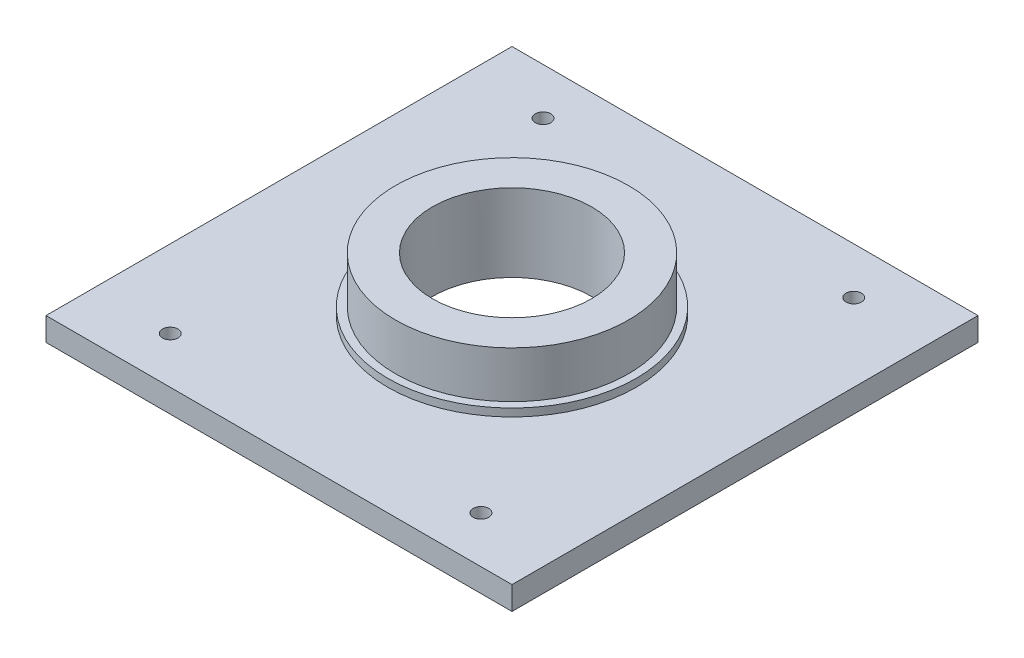
ISO-10303-21;
HEADER;
FILE_DESCRIPTION(('STEP AP214'),'2;1');
FILE_NAME('part.step','',(''),(''),'','','');
FILE_SCHEMA(('AUTOMOTIVE_DESIGN { 1 0 10303 214 1 1 1 1 }'));
ENDSEC;
DATA;
#1=APPLICATION_CONTEXT('core data for automotive mechanical design processes');
#2=APPLICATION_PROTOCOL_DEFINITION('international standard','automotive_design',2000,#1);
#3=PRODUCT_CONTEXT('',#1,'mechanical');
#4=PRODUCT('Part','Part','',(#3));
#5=PRODUCT_RELATED_PRODUCT_CATEGORY('part','',(#4));
#6=PRODUCT_DEFINITION_FORMATION('','',#4);
#7=PRODUCT_DEFINITION_CONTEXT('part definition',#1,'design');
#8=PRODUCT_DEFINITION('design','',#6,#7);
#9=PRODUCT_DEFINITION_SHAPE('','',#8);
#10=(LENGTH_UNIT() NAMED_UNIT(*) SI_UNIT(.MILLI.,.METRE.));
#11=(NAMED_UNIT(*) PLANE_ANGLE_UNIT() SI_UNIT($,.RADIAN.));
#12=(NAMED_UNIT(*) SI_UNIT($,.STERADIAN.) SOLID_ANGLE_UNIT());
#13=UNCERTAINTY_MEASURE_WITH_UNIT(LENGTH_MEASURE(1.E-05),#10,'distance_accuracy_value','');
#14=(GEOMETRIC_REPRESENTATION_CONTEXT(3) GLOBAL_UNCERTAINTY_ASSIGNED_CONTEXT((#13)) GLOBAL_UNIT_ASSIGNED_CONTEXT((#10,
#11,#12)) REPRESENTATION_CONTEXT('',''));
#15=CARTESIAN_POINT('',(0.,0.,0.));
#16=DIRECTION('',(0.,0.,1.));
#17=DIRECTION('',(1.,0.,0.));
#18=AXIS2_PLACEMENT_3D('',#15,#16,#17);
#19=CARTESIAN_POINT('',(0.,4.,0.));
#20=DIRECTION('',(0.,1.,0.));
#21=DIRECTION('',(0.,0.,1.));
#22=AXIS2_PLACEMENT_3D('',#19,#20,#21);
#23=PLANE('',#22);
#24=CARTESIAN_POINT('',(0.,4.,0.));
#25=DIRECTION('',(0.,1.,0.));
#26=DIRECTION('',(0.,0.,1.));
#27=AXIS2_PLACEMENT_3D('',#24,#25,#26);
#28=CIRCLE('',#27,16.);
#29=CARTESIAN_POINT('',(0.,4.,16.));
#30=VERTEX_POINT('',#29);
#31=EDGE_CURVE('E203',#30,#30,#28,.T.);
#32=ORIENTED_EDGE('',*,*,#31,.T.);
#33=EDGE_LOOP('',(#32));
#34=FACE_BOUND('',#33,.T.);
#35=CARTESIAN_POINT('',(0.,4.,0.));
#36=DIRECTION('',(0.,1.,0.));
#37=DIRECTION('',(0.,0.,1.));
#38=AXIS2_PLACEMENT_3D('',#35,#36,#37);
#39=CIRCLE('',#38,15.);
#40=CARTESIAN_POINT('',(0.,4.,15.));
#41=VERTEX_POINT('',#40);
#42=EDGE_CURVE('E43',#41,#41,#39,.F.);
#43=ORIENTED_EDGE('',*,*,#42,.T.);
#44=EDGE_LOOP('',(#43));
#45=FACE_BOUND('',#44,.T.);
#46=ADVANCED_FACE('F39',(#34,#45),#23,.T.);
#47=CARTESIAN_POINT('',(-30.,3.,30.));
#48=DIRECTION('',(1.,0.,0.));
#49=DIRECTION('',(0.,0.,-1.));
#50=AXIS2_PLACEMENT_3D('',#47,#48,#49);
#51=PLANE('',#50);
#52=DIRECTION('',(0.,0.,1.));
#53=VECTOR('',#52,1.);
#54=CARTESIAN_POINT('',(-30.,0.,30.));
#55=LINE('',#54,#53);
#56=CARTESIAN_POINT('',(-30.,0.,-30.));
#57=VERTEX_POINT('',#56);
#58=CARTESIAN_POINT('',(-30.,0.,30.));
#59=VERTEX_POINT('',#58);
#60=EDGE_CURVE('E108',#57,#59,#55,.T.);
#61=ORIENTED_EDGE('',*,*,#60,.T.);
#62=DIRECTION('',(0.,-1.,0.));
#63=VECTOR('',#62,1.);
#64=CARTESIAN_POINT('',(-30.,3.,30.));
#65=LINE('',#64,#63);
#66=CARTESIAN_POINT('',(-30.,3.,30.));
#67=VERTEX_POINT('',#66);
#68=EDGE_CURVE('E47',#67,#59,#65,.T.);
#69=ORIENTED_EDGE('',*,*,#68,.F.);
#70=DIRECTION('',(0.,0.,1.));
#71=VECTOR('',#70,1.);
#72=CARTESIAN_POINT('',(-30.,3.,30.));
#73=LINE('',#72,#71);
#74=CARTESIAN_POINT('',(-30.,3.,-30.));
#75=VERTEX_POINT('',#74);
#76=EDGE_CURVE('E93',#75,#67,#73,.T.);
#77=ORIENTED_EDGE('',*,*,#76,.F.);
#78=DIRECTION('',(0.,-1.,0.));
#79=VECTOR('',#78,1.);
#80=CARTESIAN_POINT('',(-30.,3.,-30.));
#81=LINE('',#80,#79);
#82=EDGE_CURVE('E104',#75,#57,#81,.T.);
#83=ORIENTED_EDGE('',*,*,#82,.T.);
#84=EDGE_LOOP('',(#61,#69,#77,#83));
#85=FACE_BOUND('',#84,.T.);
#86=ADVANCED_FACE('F41',(#85),#51,.F.);
#87=CARTESIAN_POINT('',(30.,3.,30.));
#88=DIRECTION('',(0.,0.,-1.));
#89=DIRECTION('',(-1.,0.,0.));
#90=AXIS2_PLACEMENT_3D('',#87,#88,#89);
#91=PLANE('',#90);
#92=DIRECTION('',(1.,0.,0.));
#93=VECTOR('',#92,1.);
#94=CARTESIAN_POINT('',(30.,0.,30.));
#95=LINE('',#94,#93);
#96=CARTESIAN_POINT('',(30.,0.,30.));
#97=VERTEX_POINT('',#96);
#98=EDGE_CURVE('E100',#59,#97,#95,.T.);
#99=ORIENTED_EDGE('',*,*,#98,.T.);
#100=DIRECTION('',(0.,-1.,0.));
#101=VECTOR('',#100,1.);
#102=CARTESIAN_POINT('',(30.,3.,30.));
#103=LINE('',#102,#101);
#104=CARTESIAN_POINT('',(30.,3.,30.));
#105=VERTEX_POINT('',#104);
#106=EDGE_CURVE('E97',#105,#97,#103,.T.);
#107=ORIENTED_EDGE('',*,*,#106,.F.);
#108=DIRECTION('',(1.,0.,0.));
#109=VECTOR('',#108,1.);
#110=CARTESIAN_POINT('',(30.,3.,30.));
#111=LINE('',#110,#109);
#112=EDGE_CURVE('E87',#67,#105,#111,.T.);
#113=ORIENTED_EDGE('',*,*,#112,.F.);
#114=ORIENTED_EDGE('',*,*,#68,.T.);
#115=EDGE_LOOP('',(#99,#107,#113,#114));
#116=FACE_BOUND('',#115,.T.);
#117=ADVANCED_FACE('F96',(#116),#91,.F.);
#118=CARTESIAN_POINT('',(30.,3.,30.));
#119=DIRECTION('',(-1.,0.,0.));
#120=DIRECTION('',(0.,0.,1.));
#121=AXIS2_PLACEMENT_3D('',#118,#119,#120);
#122=PLANE('',#121);
#123=DIRECTION('',(0.,0.,-1.));
#124=VECTOR('',#123,1.);
#125=CARTESIAN_POINT('',(30.,0.,30.));
#126=LINE('',#125,#124);
#127=CARTESIAN_POINT('',(30.,0.,-30.));
#128=VERTEX_POINT('',#127);
#129=EDGE_CURVE('E74',#97,#128,#126,.T.);
#130=ORIENTED_EDGE('',*,*,#129,.T.);
#131=DIRECTION('',(0.,-1.,0.));
#132=VECTOR('',#131,1.);
#133=CARTESIAN_POINT('',(30.,3.,-30.));
#134=LINE('',#133,#132);
#135=CARTESIAN_POINT('',(30.,3.,-30.));
#136=VERTEX_POINT('',#135);
#137=EDGE_CURVE('E99',#136,#128,#134,.T.);
#138=ORIENTED_EDGE('',*,*,#137,.F.);
#139=DIRECTION('',(0.,0.,-1.));
#140=VECTOR('',#139,1.);
#141=CARTESIAN_POINT('',(30.,3.,30.));
#142=LINE('',#141,#140);
#143=EDGE_CURVE('E95',#105,#136,#142,.T.);
#144=ORIENTED_EDGE('',*,*,#143,.F.);
#145=ORIENTED_EDGE('',*,*,#106,.T.);
#146=EDGE_LOOP('',(#130,#138,#144,#145));
#147=FACE_BOUND('',#146,.T.);
#148=ADVANCED_FACE('F105',(#147),#122,.F.);
#149=CARTESIAN_POINT('',(30.,3.,-30.));
#150=DIRECTION('',(0.,0.,1.));
#151=DIRECTION('',(1.,0.,0.));
#152=AXIS2_PLACEMENT_3D('',#149,#150,#151);
#153=PLANE('',#152);
#154=DIRECTION('',(-1.,0.,0.));
#155=VECTOR('',#154,1.);
#156=CARTESIAN_POINT('',(30.,0.,-30.));
#157=LINE('',#156,#155);
#158=EDGE_CURVE('E82',#128,#57,#157,.T.);
#159=ORIENTED_EDGE('',*,*,#158,.T.);
#160=ORIENTED_EDGE('',*,*,#82,.F.);
#161=DIRECTION('',(-1.,0.,0.));
#162=VECTOR('',#161,1.);
#163=CARTESIAN_POINT('',(30.,3.,-30.));
#164=LINE('',#163,#162);
#165=EDGE_CURVE('E59',#136,#75,#164,.T.);
#166=ORIENTED_EDGE('',*,*,#165,.F.);
#167=ORIENTED_EDGE('',*,*,#137,.T.);
#168=EDGE_LOOP('',(#159,#160,#166,#167));
#169=FACE_BOUND('',#168,.T.);
#170=ADVANCED_FACE('F135',(#169),#153,.F.);
#171=CARTESIAN_POINT('',(0.,3.,0.));
#172=DIRECTION('',(0.,1.,0.));
#173=DIRECTION('',(0.,0.,1.));
#174=AXIS2_PLACEMENT_3D('',#171,#172,#173);
#175=PLANE('',#174);
#176=CARTESIAN_POINT('',(0.,3.,0.));
#177=DIRECTION('',(0.,1.,0.));
#178=DIRECTION('',(0.,0.,1.));
#179=AXIS2_PLACEMENT_3D('',#176,#177,#178);
#180=CIRCLE('',#179,16.);
#181=CARTESIAN_POINT('',(0.,3.,16.));
#182=VERTEX_POINT('',#181);
#183=EDGE_CURVE('E11',#182,#182,#180,.T.);
#184=ORIENTED_EDGE('',*,*,#183,.F.);
#185=EDGE_LOOP('',(#184));
#186=FACE_BOUND('',#185,.T.);
#187=CARTESIAN_POINT('',(20.,3.,-24.));
#188=DIRECTION('',(0.,1.,0.));
#189=DIRECTION('',(0.,0.,1.));
#190=AXIS2_PLACEMENT_3D('',#187,#188,#189);
#191=CIRCLE('',#190,1.);
#192=CARTESIAN_POINT('',(20.,3.,-23.));
#193=VERTEX_POINT('',#192);
#194=EDGE_CURVE('E181',#193,#193,#191,.T.);
#195=ORIENTED_EDGE('',*,*,#194,.F.);
#196=EDGE_LOOP('',(#195));
#197=FACE_BOUND('',#196,.T.);
#198=CARTESIAN_POINT('',(-20.,3.,24.));
#199=DIRECTION('',(0.,1.,0.));
#200=DIRECTION('',(0.,0.,1.));
#201=AXIS2_PLACEMENT_3D('',#198,#199,#200);
#202=CIRCLE('',#201,1.);
#203=CARTESIAN_POINT('',(-20.,3.,25.));
#204=VERTEX_POINT('',#203);
#205=EDGE_CURVE('E176',#204,#204,#202,.T.);
#206=ORIENTED_EDGE('',*,*,#205,.F.);
#207=EDGE_LOOP('',(#206));
#208=FACE_BOUND('',#207,.T.);
#209=CARTESIAN_POINT('',(20.,3.,24.));
#210=DIRECTION('',(0.,1.,0.));
#211=DIRECTION('',(0.,0.,1.));
#212=AXIS2_PLACEMENT_3D('',#209,#210,#211);
#213=CIRCLE('',#212,1.);
#214=CARTESIAN_POINT('',(20.,3.,25.));
#215=VERTEX_POINT('',#214);
#216=EDGE_CURVE('E182',#215,#215,#213,.T.);
#217=ORIENTED_EDGE('',*,*,#216,.F.);
#218=EDGE_LOOP('',(#217));
#219=FACE_BOUND('',#218,.T.);
#220=CARTESIAN_POINT('',(-20.,3.,-24.));
#221=DIRECTION('',(0.,1.,0.));
#222=DIRECTION('',(0.,0.,1.));
#223=AXIS2_PLACEMENT_3D('',#220,#221,#222);
#224=CIRCLE('',#223,1.);
#225=CARTESIAN_POINT('',(-20.,3.,-23.));
#226=VERTEX_POINT('',#225);
#227=EDGE_CURVE('E186',#226,#226,#224,.T.);
#228=ORIENTED_EDGE('',*,*,#227,.F.);
#229=EDGE_LOOP('',(#228));
#230=FACE_BOUND('',#229,.T.);
#231=ORIENTED_EDGE('',*,*,#76,.T.);
#232=ORIENTED_EDGE('',*,*,#112,.T.);
#233=ORIENTED_EDGE('',*,*,#143,.T.);
#234=ORIENTED_EDGE('',*,*,#165,.T.);
#235=EDGE_LOOP('',(#231,#232,#233,#234));
#236=FACE_BOUND('',#235,.T.);
#237=ADVANCED_FACE('F89',(#186,#197,#208,#219,#230,#236),#175,.T.);
#238=CARTESIAN_POINT('',(0.,0.,0.));
#239=DIRECTION('',(0.,1.,0.));
#240=DIRECTION('',(0.,0.,1.));
#241=AXIS2_PLACEMENT_3D('',#238,#239,#240);
#242=PLANE('',#241);
#243=CARTESIAN_POINT('',(0.,0.,0.));
#244=DIRECTION('',(0.,-1.,0.));
#245=DIRECTION('',(0.,0.,-1.));
#246=AXIS2_PLACEMENT_3D('',#243,#244,#245);
#247=CIRCLE('',#246,10.25);
#248=CARTESIAN_POINT('',(0.,0.,-10.25));
#249=VERTEX_POINT('',#248);
#250=EDGE_CURVE('E199',#249,#249,#247,.T.);
#251=ORIENTED_EDGE('',*,*,#250,.F.);
#252=EDGE_LOOP('',(#251));
#253=FACE_BOUND('',#252,.T.);
#254=CARTESIAN_POINT('',(20.,0.,-24.));
#255=DIRECTION('',(0.,1.,0.));
#256=DIRECTION('',(0.,0.,1.));
#257=AXIS2_PLACEMENT_3D('',#254,#255,#256);
#258=CIRCLE('',#257,1.);
#259=CARTESIAN_POINT('',(20.,0.,-23.));
#260=VERTEX_POINT('',#259);
#261=EDGE_CURVE('E178',#260,#260,#258,.T.);
#262=ORIENTED_EDGE('',*,*,#261,.T.);
#263=EDGE_LOOP('',(#262));
#264=FACE_BOUND('',#263,.T.);
#265=CARTESIAN_POINT('',(-20.,0.,24.));
#266=DIRECTION('',(0.,1.,0.));
#267=DIRECTION('',(0.,0.,1.));
#268=AXIS2_PLACEMENT_3D('',#265,#266,#267);
#269=CIRCLE('',#268,1.);
#270=CARTESIAN_POINT('',(-20.,0.,25.));
#271=VERTEX_POINT('',#270);
#272=EDGE_CURVE('E173',#271,#271,#269,.T.);
#273=ORIENTED_EDGE('',*,*,#272,.T.);
#274=EDGE_LOOP('',(#273));
#275=FACE_BOUND('',#274,.T.);
#276=CARTESIAN_POINT('',(20.,0.,24.));
#277=DIRECTION('',(0.,1.,0.));
#278=DIRECTION('',(0.,0.,1.));
#279=AXIS2_PLACEMENT_3D('',#276,#277,#278);
#280=CIRCLE('',#279,1.);
#281=CARTESIAN_POINT('',(20.,0.,25.));
#282=VERTEX_POINT('',#281);
#283=EDGE_CURVE('E200',#282,#282,#280,.T.);
#284=ORIENTED_EDGE('',*,*,#283,.T.);
#285=EDGE_LOOP('',(#284));
#286=FACE_BOUND('',#285,.T.);
#287=CARTESIAN_POINT('',(-20.,0.,-24.));
#288=DIRECTION('',(0.,1.,0.));
#289=DIRECTION('',(0.,0.,1.));
#290=AXIS2_PLACEMENT_3D('',#287,#288,#289);
#291=CIRCLE('',#290,1.);
#292=CARTESIAN_POINT('',(-20.,0.,-23.));
#293=VERTEX_POINT('',#292);
#294=EDGE_CURVE('E111',#293,#293,#291,.T.);
#295=ORIENTED_EDGE('',*,*,#294,.T.);
#296=EDGE_LOOP('',(#295));
#297=FACE_BOUND('',#296,.T.);
#298=ORIENTED_EDGE('',*,*,#60,.F.);
#299=ORIENTED_EDGE('',*,*,#158,.F.);
#300=ORIENTED_EDGE('',*,*,#129,.F.);
#301=ORIENTED_EDGE('',*,*,#98,.F.);
#302=EDGE_LOOP('',(#298,#299,#300,#301));
#303=FACE_BOUND('',#302,.T.);
#304=ADVANCED_FACE('F118',(#253,#264,#275,#286,#297,#303),#242,.F.);
#305=CARTESIAN_POINT('',(-20.,0.,-24.));
#306=DIRECTION('',(0.,1.,0.));
#307=DIRECTION('',(0.,0.,1.));
#308=AXIS2_PLACEMENT_3D('',#305,#306,#307);
#309=CYLINDRICAL_SURFACE('',#308,1.);
#310=ORIENTED_EDGE('',*,*,#294,.F.);
#311=EDGE_LOOP('',(#310));
#312=FACE_BOUND('',#311,.T.);
#313=ORIENTED_EDGE('',*,*,#227,.T.);
#314=EDGE_LOOP('',(#313));
#315=FACE_BOUND('',#314,.T.);
#316=ADVANCED_FACE('F122',(#312,#315),#309,.F.);
#317=CARTESIAN_POINT('',(20.,0.,24.));
#318=DIRECTION('',(0.,1.,0.));
#319=DIRECTION('',(0.,0.,1.));
#320=AXIS2_PLACEMENT_3D('',#317,#318,#319);
#321=CYLINDRICAL_SURFACE('',#320,1.);
#322=ORIENTED_EDGE('',*,*,#283,.F.);
#323=EDGE_LOOP('',(#322));
#324=FACE_BOUND('',#323,.T.);
#325=ORIENTED_EDGE('',*,*,#216,.T.);
#326=EDGE_LOOP('',(#325));
#327=FACE_BOUND('',#326,.T.);
#328=ADVANCED_FACE('F126',(#324,#327),#321,.F.);
#329=CARTESIAN_POINT('',(-20.,0.,24.));
#330=DIRECTION('',(0.,1.,0.));
#331=DIRECTION('',(0.,0.,1.));
#332=AXIS2_PLACEMENT_3D('',#329,#330,#331);
#333=CYLINDRICAL_SURFACE('',#332,1.);
#334=ORIENTED_EDGE('',*,*,#272,.F.);
#335=EDGE_LOOP('',(#334));
#336=FACE_BOUND('',#335,.T.);
#337=ORIENTED_EDGE('',*,*,#205,.T.);
#338=EDGE_LOOP('',(#337));
#339=FACE_BOUND('',#338,.T.);
#340=ADVANCED_FACE('F162',(#336,#339),#333,.F.);
#341=CARTESIAN_POINT('',(20.,0.,-24.));
#342=DIRECTION('',(0.,1.,0.));
#343=DIRECTION('',(0.,0.,1.));
#344=AXIS2_PLACEMENT_3D('',#341,#342,#343);
#345=CYLINDRICAL_SURFACE('',#344,1.);
#346=ORIENTED_EDGE('',*,*,#261,.F.);
#347=EDGE_LOOP('',(#346));
#348=FACE_BOUND('',#347,.T.);
#349=ORIENTED_EDGE('',*,*,#194,.T.);
#350=EDGE_LOOP('',(#349));
#351=FACE_BOUND('',#350,.T.);
#352=ADVANCED_FACE('F157',(#348,#351),#345,.F.);
#353=CARTESIAN_POINT('',(0.,3.,0.));
#354=DIRECTION('',(0.,-1.,0.));
#355=DIRECTION('',(0.,0.,-1.));
#356=AXIS2_PLACEMENT_3D('',#353,#354,#355);
#357=CYLINDRICAL_SURFACE('',#356,10.25);
#358=CARTESIAN_POINT('',(0.,10.,0.));
#359=DIRECTION('',(0.,1.,0.));
#360=DIRECTION('',(0.,0.,1.));
#361=AXIS2_PLACEMENT_3D('',#358,#359,#360);
#362=CIRCLE('',#361,10.25);
#363=CARTESIAN_POINT('',(0.,10.,10.25));
#364=VERTEX_POINT('',#363);
#365=EDGE_CURVE('E208',#364,#364,#362,.T.);
#366=ORIENTED_EDGE('',*,*,#365,.T.);
#367=EDGE_LOOP('',(#366));
#368=FACE_BOUND('',#367,.T.);
#369=ORIENTED_EDGE('',*,*,#250,.T.);
#370=EDGE_LOOP('',(#369));
#371=FACE_BOUND('',#370,.T.);
#372=ADVANCED_FACE('F154',(#368,#371),#357,.F.);
#373=CARTESIAN_POINT('',(0.,4.,0.));
#374=DIRECTION('',(0.,-1.,0.));
#375=DIRECTION('',(0.,0.,-1.));
#376=AXIS2_PLACEMENT_3D('',#373,#374,#375);
#377=CYLINDRICAL_SURFACE('',#376,16.);
#378=ORIENTED_EDGE('',*,*,#31,.F.);
#379=EDGE_LOOP('',(#378));
#380=FACE_BOUND('',#379,.T.);
#381=ORIENTED_EDGE('',*,*,#183,.T.);
#382=EDGE_LOOP('',(#381));
#383=FACE_BOUND('',#382,.T.);
#384=ADVANCED_FACE('F155',(#380,#383),#377,.T.);
#385=CARTESIAN_POINT('',(0.,10.,0.));
#386=DIRECTION('',(0.,1.,0.));
#387=DIRECTION('',(0.,0.,1.));
#388=AXIS2_PLACEMENT_3D('',#385,#386,#387);
#389=PLANE('',#388);
#390=CARTESIAN_POINT('',(0.,10.,0.));
#391=DIRECTION('',(0.,1.,0.));
#392=DIRECTION('',(0.,0.,1.));
#393=AXIS2_PLACEMENT_3D('',#390,#391,#392);
#394=CIRCLE('',#393,15.);
#395=CARTESIAN_POINT('',(0.,10.,15.));
#396=VERTEX_POINT('',#395);
#397=EDGE_CURVE('E210',#396,#396,#394,.T.);
#398=ORIENTED_EDGE('',*,*,#397,.T.);
#399=EDGE_LOOP('',(#398));
#400=FACE_BOUND('',#399,.T.);
#401=ORIENTED_EDGE('',*,*,#365,.F.);
#402=EDGE_LOOP('',(#401));
#403=FACE_BOUND('',#402,.T.);
#404=ADVANCED_FACE('F152',(#400,#403),#389,.T.);
#405=CARTESIAN_POINT('',(0.,10.,0.));
#406=DIRECTION('',(0.,-1.,0.));
#407=DIRECTION('',(0.,0.,-1.));
#408=AXIS2_PLACEMENT_3D('',#405,#406,#407);
#409=CYLINDRICAL_SURFACE('',#408,15.);
#410=ORIENTED_EDGE('',*,*,#42,.F.);
#411=EDGE_LOOP('',(#410));
#412=FACE_BOUND('',#411,.T.);
#413=ORIENTED_EDGE('',*,*,#397,.F.);
#414=EDGE_LOOP('',(#413));
#415=FACE_BOUND('',#414,.T.);
#416=ADVANCED_FACE('F148',(#412,#415),#409,.T.);
#417=CLOSED_SHELL('',(#46,#86,#117,#148,#170,#237,#304,#316,#328,#340,#352,#372,#384,#404,#416));
#418=MANIFOLD_SOLID_BREP('B2',#417);
#419=ADVANCED_BREP_SHAPE_REPRESENTATION('',(#18,#418),#14);
#420=SHAPE_DEFINITION_REPRESENTATION(#9,#419);
ENDSEC;
END-ISO-10303-21;
